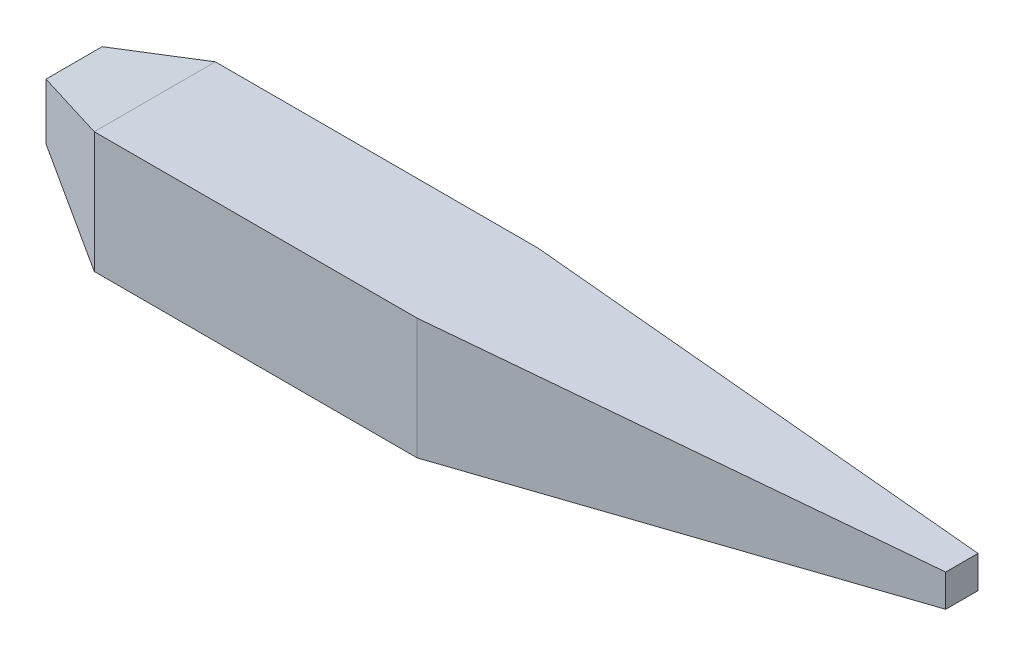
ISO-10303-21;
HEADER;
FILE_DESCRIPTION(('STEP AP214'),'2;1');
FILE_NAME('part.step','',(''),(''),'','','');
FILE_SCHEMA(('AUTOMOTIVE_DESIGN { 1 0 10303 214 1 1 1 1 }'));
ENDSEC;
DATA;
#1=APPLICATION_CONTEXT('core data for automotive mechanical design processes');
#2=APPLICATION_PROTOCOL_DEFINITION('international standard','automotive_design',2000,#1);
#3=PRODUCT_CONTEXT('',#1,'mechanical');
#4=PRODUCT('Part','Part','',(#3));
#5=PRODUCT_RELATED_PRODUCT_CATEGORY('part','',(#4));
#6=PRODUCT_DEFINITION_FORMATION('','',#4);
#7=PRODUCT_DEFINITION_CONTEXT('part definition',#1,'design');
#8=PRODUCT_DEFINITION('design','',#6,#7);
#9=PRODUCT_DEFINITION_SHAPE('','',#8);
#10=(LENGTH_UNIT() NAMED_UNIT(*) SI_UNIT(.MILLI.,.METRE.));
#11=(NAMED_UNIT(*) PLANE_ANGLE_UNIT() SI_UNIT($,.RADIAN.));
#12=(NAMED_UNIT(*) SI_UNIT($,.STERADIAN.) SOLID_ANGLE_UNIT());
#13=UNCERTAINTY_MEASURE_WITH_UNIT(LENGTH_MEASURE(1.E-05),#10,'distance_accuracy_value','');
#14=(GEOMETRIC_REPRESENTATION_CONTEXT(3) GLOBAL_UNCERTAINTY_ASSIGNED_CONTEXT((#13)) GLOBAL_UNIT_ASSIGNED_CONTEXT((#10,
#11,#12)) REPRESENTATION_CONTEXT('',''));
#15=CARTESIAN_POINT('',(0.,0.,0.));
#16=DIRECTION('',(0.,0.,1.));
#17=DIRECTION('',(1.,0.,0.));
#18=AXIS2_PLACEMENT_3D('',#15,#16,#17);
#19=CARTESIAN_POINT('',(-200.,75.,75.));
#20=DIRECTION('',(0.,-1.,0.));
#21=DIRECTION('',(1.,0.,0.));
#22=AXIS2_PLACEMENT_3D('',#19,#20,#21);
#23=PLANE('',#22);
#24=DIRECTION('',(-1.,0.,0.));
#25=VECTOR('',#24,1.);
#26=CARTESIAN_POINT('',(-200.,75.,-75.));
#27=LINE('',#26,#25);
#28=CARTESIAN_POINT('',(200.000000000001,75.,-75.));
#29=VERTEX_POINT('',#28);
#30=CARTESIAN_POINT('',(-200.,75.,-75.));
#31=VERTEX_POINT('',#30);
#32=EDGE_CURVE('E374',#29,#31,#27,.T.);
#33=ORIENTED_EDGE('',*,*,#32,.T.);
#34=DIRECTION('',(0.,0.,1.));
#35=VECTOR('',#34,1.);
#36=CARTESIAN_POINT('',(-200.,75.,0.));
#37=LINE('',#36,#35);
#38=CARTESIAN_POINT('',(-200.,75.,75.));
#39=VERTEX_POINT('',#38);
#40=EDGE_CURVE('E12',#39,#31,#37,.F.);
#41=ORIENTED_EDGE('',*,*,#40,.F.);
#42=DIRECTION('',(-1.,0.,0.));
#43=VECTOR('',#42,1.);
#44=CARTESIAN_POINT('',(-200.,75.,75.));
#45=LINE('',#44,#43);
#46=CARTESIAN_POINT('',(200.000000000001,75.,74.9999999999999));
#47=VERTEX_POINT('',#46);
#48=EDGE_CURVE('E148',#47,#39,#45,.T.);
#49=ORIENTED_EDGE('',*,*,#48,.F.);
#50=DIRECTION('',(-0.995824904563132,0.,0.0912839495849538));
#51=VECTOR('',#50,1.);
#52=CARTESIAN_POINT('',(800.,75.0000000000001,20.));
#53=LINE('',#52,#51);
#54=CARTESIAN_POINT('',(800.,75.0000000000001,20.));
#55=VERTEX_POINT('',#54);
#56=EDGE_CURVE('E138',#55,#47,#53,.T.);
#57=ORIENTED_EDGE('',*,*,#56,.F.);
#58=DIRECTION('',(0.,0.,1.));
#59=VECTOR('',#58,1.);
#60=CARTESIAN_POINT('',(800.,75.0000000000001,20.));
#61=LINE('',#60,#59);
#62=CARTESIAN_POINT('',(800.,75.0000000000001,-20.));
#63=VERTEX_POINT('',#62);
#64=EDGE_CURVE('E115',#63,#55,#61,.T.);
#65=ORIENTED_EDGE('',*,*,#64,.F.);
#66=DIRECTION('',(-0.995824904563132,0.,-0.0912839495849538));
#67=VECTOR('',#66,1.);
#68=CARTESIAN_POINT('',(800.,75.0000000000001,-20.));
#69=LINE('',#68,#67);
#70=EDGE_CURVE('E154',#63,#29,#69,.T.);
#71=ORIENTED_EDGE('',*,*,#70,.T.);
#72=EDGE_LOOP('',(#33,#41,#49,#57,#65,#71));
#73=FACE_BOUND('',#72,.T.);
#74=ADVANCED_FACE('F51',(#73),#23,.F.);
#75=CARTESIAN_POINT('',(-200.,-75.,75.));
#76=DIRECTION('',(0.,1.,0.));
#77=DIRECTION('',(-1.,0.,0.));
#78=AXIS2_PLACEMENT_3D('',#75,#76,#77);
#79=PLANE('',#78);
#80=DIRECTION('',(1.,0.,0.));
#81=VECTOR('',#80,1.);
#82=CARTESIAN_POINT('',(-200.,-75.,-75.));
#83=LINE('',#82,#81);
#84=CARTESIAN_POINT('',(-200.,-75.,-75.));
#85=VERTEX_POINT('',#84);
#86=CARTESIAN_POINT('',(199.999999999999,-75.0000000000001,-75.));
#87=VERTEX_POINT('',#86);
#88=EDGE_CURVE('E373',#85,#87,#83,.T.);
#89=ORIENTED_EDGE('',*,*,#88,.T.);
#90=DIRECTION('',(0.,0.,1.));
#91=VECTOR('',#90,1.);
#92=CARTESIAN_POINT('',(200.,-75.,0.));
#93=LINE('',#92,#91);
#94=CARTESIAN_POINT('',(199.999999999999,-75.0000000000001,75.));
#95=VERTEX_POINT('',#94);
#96=EDGE_CURVE('E376',#95,#87,#93,.F.);
#97=ORIENTED_EDGE('',*,*,#96,.F.);
#98=DIRECTION('',(1.,0.,0.));
#99=VECTOR('',#98,1.);
#100=CARTESIAN_POINT('',(-200.,-75.,75.));
#101=LINE('',#100,#99);
#102=CARTESIAN_POINT('',(-200.,-75.,75.));
#103=VERTEX_POINT('',#102);
#104=EDGE_CURVE('E69',#103,#95,#101,.T.);
#105=ORIENTED_EDGE('',*,*,#104,.F.);
#106=DIRECTION('',(0.,0.,1.));
#107=VECTOR('',#106,1.);
#108=CARTESIAN_POINT('',(-200.,-75.,75.));
#109=LINE('',#108,#107);
#110=EDGE_CURVE('E61',#103,#85,#109,.F.);
#111=ORIENTED_EDGE('',*,*,#110,.T.);
#112=EDGE_LOOP('',(#89,#97,#105,#111));
#113=FACE_BOUND('',#112,.T.);
#114=ADVANCED_FACE('F394',(#113),#79,.F.);
#115=CARTESIAN_POINT('',(0.,0.,75.));
#116=DIRECTION('',(0.,0.,1.));
#117=DIRECTION('',(1.,0.,0.));
#118=AXIS2_PLACEMENT_3D('',#115,#116,#117);
#119=PLANE('',#118);
#120=DIRECTION('',(0.,1.,0.));
#121=VECTOR('',#120,1.);
#122=CARTESIAN_POINT('',(200.,0.,75.));
#123=LINE('',#122,#121);
#124=EDGE_CURVE('E55',#95,#47,#123,.T.);
#125=ORIENTED_EDGE('',*,*,#124,.T.);
#126=ORIENTED_EDGE('',*,*,#48,.T.);
#127=DIRECTION('',(0.,1.,0.));
#128=VECTOR('',#127,1.);
#129=CARTESIAN_POINT('',(-200.,0.,75.));
#130=LINE('',#129,#128);
#131=EDGE_CURVE('E377',#39,#103,#130,.F.);
#132=ORIENTED_EDGE('',*,*,#131,.T.);
#133=ORIENTED_EDGE('',*,*,#104,.T.);
#134=EDGE_LOOP('',(#125,#126,#132,#133));
#135=FACE_BOUND('',#134,.T.);
#136=ADVANCED_FACE('F397',(#135),#119,.T.);
#137=CARTESIAN_POINT('',(0.,0.,-75.));
#138=DIRECTION('',(0.,0.,1.));
#139=DIRECTION('',(1.,0.,0.));
#140=AXIS2_PLACEMENT_3D('',#137,#138,#139);
#141=PLANE('',#140);
#142=DIRECTION('',(0.,1.,0.));
#143=VECTOR('',#142,1.);
#144=CARTESIAN_POINT('',(200.,0.,-75.));
#145=LINE('',#144,#143);
#146=EDGE_CURVE('E259',#87,#29,#145,.T.);
#147=ORIENTED_EDGE('',*,*,#146,.F.);
#148=ORIENTED_EDGE('',*,*,#88,.F.);
#149=DIRECTION('',(0.,1.,0.));
#150=VECTOR('',#149,1.);
#151=CARTESIAN_POINT('',(-200.,0.,-75.));
#152=LINE('',#151,#150);
#153=EDGE_CURVE('E365',#31,#85,#152,.F.);
#154=ORIENTED_EDGE('',*,*,#153,.F.);
#155=ORIENTED_EDGE('',*,*,#32,.F.);
#156=EDGE_LOOP('',(#147,#148,#154,#155));
#157=FACE_BOUND('',#156,.T.);
#158=ADVANCED_FACE('F342',(#157),#141,.F.);
#159=CARTESIAN_POINT('',(-300.,0.,0.));
#160=DIRECTION('',(1.,0.,0.));
#161=DIRECTION('',(0.,0.,-1.));
#162=AXIS2_PLACEMENT_3D('',#159,#160,#161);
#163=PLANE('',#162);
#164=DIRECTION('',(0.,1.,0.));
#165=VECTOR('',#164,1.);
#166=CARTESIAN_POINT('',(-300.,-8.24530012253773,34.7932275563051));
#167=LINE('',#166,#165);
#168=CARTESIAN_POINT('',(-300.,-8.24530012253773,34.7932275563051));
#169=VERTEX_POINT('',#168);
#170=CARTESIAN_POINT('',(-300.,61.3411549900725,34.7932275563051));
#171=VERTEX_POINT('',#170);
#172=EDGE_CURVE('E149',#169,#171,#167,.T.);
#173=ORIENTED_EDGE('',*,*,#172,.T.);
#174=DIRECTION('',(0.,0.,-1.));
#175=VECTOR('',#174,1.);
#176=CARTESIAN_POINT('',(-300.,61.3411549900725,-34.7932275563051));
#177=LINE('',#176,#175);
#178=CARTESIAN_POINT('',(-300.,61.3411549900725,-34.7932275563051));
#179=VERTEX_POINT('',#178);
#180=EDGE_CURVE('E152',#171,#179,#177,.T.);
#181=ORIENTED_EDGE('',*,*,#180,.T.);
#182=DIRECTION('',(0.,-1.,0.));
#183=VECTOR('',#182,1.);
#184=CARTESIAN_POINT('',(-300.,-8.24530012253773,-34.7932275563051));
#185=LINE('',#184,#183);
#186=CARTESIAN_POINT('',(-300.,-8.24530012253773,-34.7932275563051));
#187=VERTEX_POINT('',#186);
#188=EDGE_CURVE('E310',#179,#187,#185,.T.);
#189=ORIENTED_EDGE('',*,*,#188,.T.);
#190=DIRECTION('',(0.,0.,1.));
#191=VECTOR('',#190,1.);
#192=CARTESIAN_POINT('',(-300.,-8.24530012253773,-34.7932275563051));
#193=LINE('',#192,#191);
#194=EDGE_CURVE('E249',#187,#169,#193,.T.);
#195=ORIENTED_EDGE('',*,*,#194,.T.);
#196=EDGE_LOOP('',(#173,#181,#189,#195));
#197=FACE_BOUND('',#196,.T.);
#198=ADVANCED_FACE('F334',(#197),#163,.F.);
#199=CARTESIAN_POINT('',(-53.7910003312708,0.,133.785919789009));
#200=DIRECTION('',(0.373043934599461,0.,-0.927813678956369));
#201=DIRECTION('',(-0.927813678956369,0.,-0.373043934599461));
#202=AXIS2_PLACEMENT_3D('',#199,#200,#201);
#203=PLANE('',#202);
#204=DIRECTION('',(-0.920451823878551,-0.125723088014622,-0.370083970280688));
#205=VECTOR('',#204,1.);
#206=CARTESIAN_POINT('',(-200.,75.,75.));
#207=LINE('',#206,#205);
#208=EDGE_CURVE('E240',#39,#171,#207,.T.);
#209=ORIENTED_EDGE('',*,*,#208,.T.);
#210=ORIENTED_EDGE('',*,*,#172,.F.);
#211=DIRECTION('',(-0.7887776095414,0.526546125949982,-0.317142018555127));
#212=VECTOR('',#211,1.);
#213=CARTESIAN_POINT('',(-200.,-75.,75.));
#214=LINE('',#213,#212);
#215=EDGE_CURVE('E248',#103,#169,#214,.T.);
#216=ORIENTED_EDGE('',*,*,#215,.F.);
#217=ORIENTED_EDGE('',*,*,#131,.F.);
#218=EDGE_LOOP('',(#209,#210,#216,#217));
#219=FACE_BOUND('',#218,.T.);
#220=ADVANCED_FACE('F288',(#219),#203,.F.);
#221=CARTESIAN_POINT('',(-96.2838925394215,-144.235376259895,0.));
#222=DIRECTION('',(0.55520698918644,0.831712209335975,0.));
#223=DIRECTION('',(-0.831712209335975,0.55520698918644,0.));
#224=AXIS2_PLACEMENT_3D('',#221,#222,#223);
#225=PLANE('',#224);
#226=ORIENTED_EDGE('',*,*,#215,.T.);
#227=ORIENTED_EDGE('',*,*,#194,.F.);
#228=DIRECTION('',(-0.7887776095414,0.526546125949982,0.317142018555127));
#229=VECTOR('',#228,1.);
#230=CARTESIAN_POINT('',(-200.,-75.,-75.));
#231=LINE('',#230,#229);
#232=EDGE_CURVE('E255',#85,#187,#231,.T.);
#233=ORIENTED_EDGE('',*,*,#232,.F.);
#234=ORIENTED_EDGE('',*,*,#110,.F.);
#235=EDGE_LOOP('',(#226,#227,#233,#234));
#236=FACE_BOUND('',#235,.T.);
#237=ADVANCED_FACE('F277',(#236),#225,.F.);
#238=CARTESIAN_POINT('',(-13.7194589196725,100.443770389816,0.));
#239=DIRECTION('',(0.135331880616487,-0.990800324025384,0.));
#240=DIRECTION('',(0.990800324025384,0.135331880616487,0.));
#241=AXIS2_PLACEMENT_3D('',#238,#239,#240);
#242=PLANE('',#241);
#243=DIRECTION('',(-0.920451823878551,-0.125723088014622,0.370083970280688));
#244=VECTOR('',#243,1.);
#245=CARTESIAN_POINT('',(-200.,75.,-75.));
#246=LINE('',#245,#244);
#247=EDGE_CURVE('E252',#31,#179,#246,.T.);
#248=ORIENTED_EDGE('',*,*,#247,.T.);
#249=ORIENTED_EDGE('',*,*,#180,.F.);
#250=ORIENTED_EDGE('',*,*,#208,.F.);
#251=ORIENTED_EDGE('',*,*,#40,.T.);
#252=EDGE_LOOP('',(#248,#249,#250,#251));
#253=FACE_BOUND('',#252,.T.);
#254=ADVANCED_FACE('F287',(#253),#242,.F.);
#255=CARTESIAN_POINT('',(-53.7910003312708,0.,-133.785919789009));
#256=DIRECTION('',(0.373043934599461,0.,0.927813678956369));
#257=DIRECTION('',(0.927813678956369,0.,-0.373043934599461));
#258=AXIS2_PLACEMENT_3D('',#255,#256,#257);
#259=PLANE('',#258);
#260=ORIENTED_EDGE('',*,*,#232,.T.);
#261=ORIENTED_EDGE('',*,*,#188,.F.);
#262=ORIENTED_EDGE('',*,*,#247,.F.);
#263=ORIENTED_EDGE('',*,*,#153,.T.);
#264=EDGE_LOOP('',(#260,#261,#262,#263));
#265=FACE_BOUND('',#264,.T.);
#266=ADVANCED_FACE('F293',(#265),#259,.F.);
#267=CARTESIAN_POINT('',(800.,0.,0.));
#268=DIRECTION('',(1.,0.,0.));
#269=DIRECTION('',(0.,0.,-1.));
#270=AXIS2_PLACEMENT_3D('',#267,#268,#269);
#271=PLANE('',#270);
#272=DIRECTION('',(0.,-1.,0.));
#273=VECTOR('',#272,1.);
#274=CARTESIAN_POINT('',(800.,75.0000000000001,20.));
#275=LINE('',#274,#273);
#276=CARTESIAN_POINT('',(800.,35.0000000000001,20.));
#277=VERTEX_POINT('',#276);
#278=EDGE_CURVE('E120',#55,#277,#275,.T.);
#279=ORIENTED_EDGE('',*,*,#278,.T.);
#280=DIRECTION('',(0.,0.,-1.));
#281=VECTOR('',#280,1.);
#282=CARTESIAN_POINT('',(800.,35.0000000000001,20.));
#283=LINE('',#282,#281);
#284=CARTESIAN_POINT('',(800.,35.0000000000001,-20.));
#285=VERTEX_POINT('',#284);
#286=EDGE_CURVE('E141',#277,#285,#283,.T.);
#287=ORIENTED_EDGE('',*,*,#286,.T.);
#288=DIRECTION('',(0.,1.,0.));
#289=VECTOR('',#288,1.);
#290=CARTESIAN_POINT('',(800.,75.0000000000001,-20.));
#291=LINE('',#290,#289);
#292=EDGE_CURVE('E122',#285,#63,#291,.T.);
#293=ORIENTED_EDGE('',*,*,#292,.T.);
#294=ORIENTED_EDGE('',*,*,#64,.T.);
#295=EDGE_LOOP('',(#279,#287,#293,#294));
#296=FACE_BOUND('',#295,.T.);
#297=ADVANCED_FACE('F118',(#296),#271,.T.);
#298=CARTESIAN_POINT('',(8.48426416913436,0.,-92.5556091178293));
#299=DIRECTION('',(0.0912839495849538,0.,-0.995824904563132));
#300=DIRECTION('',(-0.995824904563132,0.,-0.0912839495849538));
#301=AXIS2_PLACEMENT_3D('',#298,#299,#300);
#302=PLANE('',#301);
#303=DIRECTION('',(-0.979632638610578,-0.179599317078606,-0.089799658539303));
#304=VECTOR('',#303,1.);
#305=CARTESIAN_POINT('',(800.,35.0000000000001,-20.));
#306=LINE('',#305,#304);
#307=EDGE_CURVE('E128',#285,#87,#306,.T.);
#308=ORIENTED_EDGE('',*,*,#307,.T.);
#309=ORIENTED_EDGE('',*,*,#146,.T.);
#310=ORIENTED_EDGE('',*,*,#70,.F.);
#311=ORIENTED_EDGE('',*,*,#292,.F.);
#312=EDGE_LOOP('',(#308,#309,#310,#311));
#313=FACE_BOUND('',#312,.T.);
#314=ADVANCED_FACE('F171',(#313),#302,.T.);
#315=CARTESIAN_POINT('',(19.806503628057,-108.035474334856,0.));
#316=DIRECTION('',(0.180327868852459,-0.983606557377049,0.));
#317=DIRECTION('',(0.983606557377049,0.180327868852459,0.));
#318=AXIS2_PLACEMENT_3D('',#315,#316,#317);
#319=PLANE('',#318);
#320=DIRECTION('',(-0.979632638610578,-0.179599317078606,0.089799658539303));
#321=VECTOR('',#320,1.);
#322=CARTESIAN_POINT('',(800.,35.0000000000001,20.));
#323=LINE('',#322,#321);
#324=EDGE_CURVE('E140',#277,#95,#323,.T.);
#325=ORIENTED_EDGE('',*,*,#324,.T.);
#326=ORIENTED_EDGE('',*,*,#96,.T.);
#327=ORIENTED_EDGE('',*,*,#307,.F.);
#328=ORIENTED_EDGE('',*,*,#286,.F.);
#329=EDGE_LOOP('',(#325,#326,#327,#328));
#330=FACE_BOUND('',#329,.T.);
#331=ADVANCED_FACE('F181',(#330),#319,.T.);
#332=CARTESIAN_POINT('',(8.48426416913436,0.,92.5556091178293));
#333=DIRECTION('',(-0.0912839495849538,0.,-0.995824904563132));
#334=DIRECTION('',(-0.995824904563132,0.,0.0912839495849538));
#335=AXIS2_PLACEMENT_3D('',#332,#333,#334);
#336=PLANE('',#335);
#337=ORIENTED_EDGE('',*,*,#56,.T.);
#338=ORIENTED_EDGE('',*,*,#124,.F.);
#339=ORIENTED_EDGE('',*,*,#324,.F.);
#340=ORIENTED_EDGE('',*,*,#278,.F.);
#341=EDGE_LOOP('',(#337,#338,#339,#340));
#342=FACE_BOUND('',#341,.T.);
#343=ADVANCED_FACE('F136',(#342),#336,.F.);
#344=CLOSED_SHELL('',(#74,#114,#136,#158,#198,#220,#237,#254,#266,#297,#314,#331,#343));
#345=MANIFOLD_SOLID_BREP('B2',#344);
#346=ADVANCED_BREP_SHAPE_REPRESENTATION('',(#18,#345),#14);
#347=SHAPE_DEFINITION_REPRESENTATION(#9,#346);
ENDSEC;
END-ISO-10303-21;
